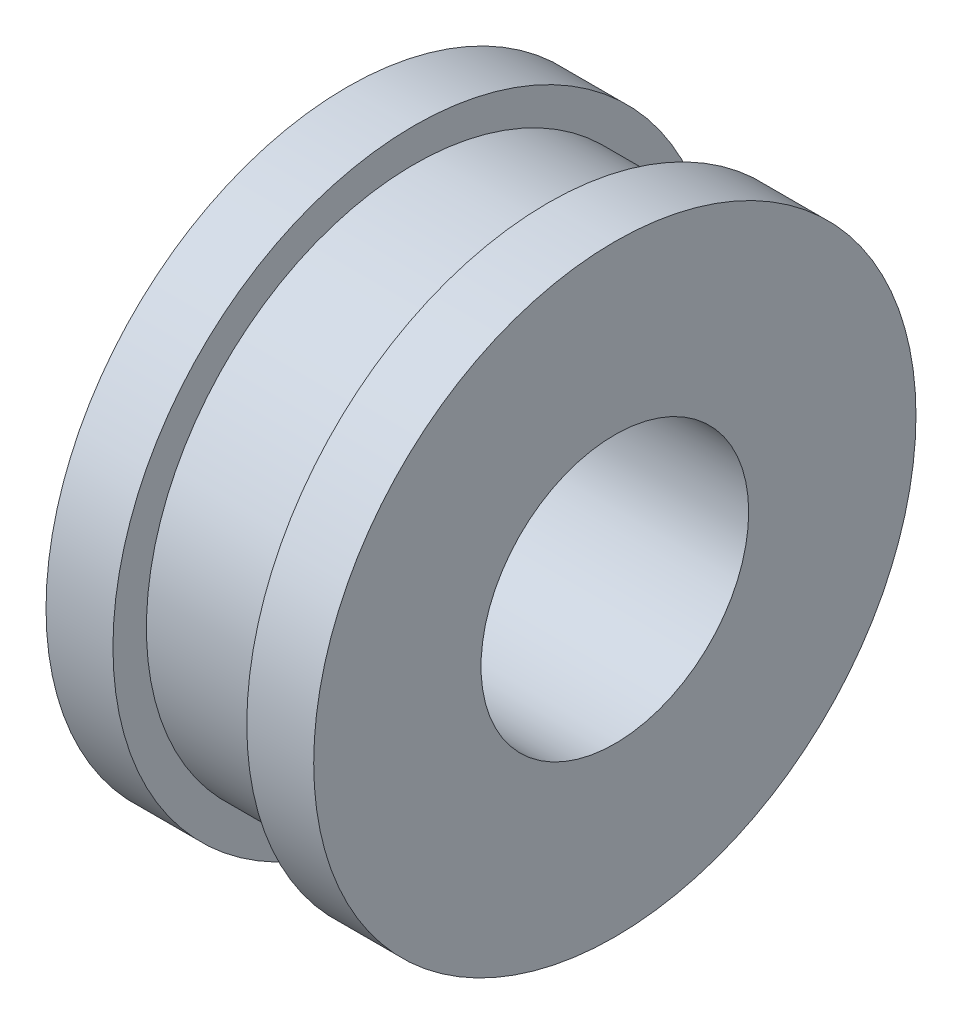
ISO-10303-21;
HEADER;
FILE_DESCRIPTION(('STEP AP214'),'2;1');
FILE_NAME('part.step','',(''),(''),'','','');
FILE_SCHEMA(('AUTOMOTIVE_DESIGN { 1 0 10303 214 1 1 1 1 }'));
ENDSEC;
DATA;
#1=APPLICATION_CONTEXT('core data for automotive mechanical design processes');
#2=APPLICATION_PROTOCOL_DEFINITION('international standard','automotive_design',2000,#1);
#3=PRODUCT_CONTEXT('',#1,'mechanical');
#4=PRODUCT('Part','Part','',(#3));
#5=PRODUCT_RELATED_PRODUCT_CATEGORY('part','',(#4));
#6=PRODUCT_DEFINITION_FORMATION('','',#4);
#7=PRODUCT_DEFINITION_CONTEXT('part definition',#1,'design');
#8=PRODUCT_DEFINITION('design','',#6,#7);
#9=PRODUCT_DEFINITION_SHAPE('','',#8);
#10=(LENGTH_UNIT() NAMED_UNIT(*) SI_UNIT(.MILLI.,.METRE.));
#11=(NAMED_UNIT(*) PLANE_ANGLE_UNIT() SI_UNIT($,.RADIAN.));
#12=(NAMED_UNIT(*) SI_UNIT($,.STERADIAN.) SOLID_ANGLE_UNIT());
#13=UNCERTAINTY_MEASURE_WITH_UNIT(LENGTH_MEASURE(1.E-05),#10,'distance_accuracy_value','');
#14=(GEOMETRIC_REPRESENTATION_CONTEXT(3) GLOBAL_UNCERTAINTY_ASSIGNED_CONTEXT((#13)) GLOBAL_UNIT_ASSIGNED_CONTEXT((#10,
#11,#12)) REPRESENTATION_CONTEXT('',''));
#15=CARTESIAN_POINT('',(0.,0.,0.));
#16=DIRECTION('',(0.,0.,1.));
#17=DIRECTION('',(1.,0.,0.));
#18=AXIS2_PLACEMENT_3D('',#15,#16,#17);
#19=CARTESIAN_POINT('',(-6.,4.,0.));
#20=DIRECTION('',(-1.,0.,0.));
#21=DIRECTION('',(0.,0.,1.));
#22=AXIS2_PLACEMENT_3D('',#19,#20,#21);
#23=PLANE('',#22);
#24=CARTESIAN_POINT('',(-6.,0.,0.));
#25=DIRECTION('',(1.,0.,0.));
#26=DIRECTION('',(0.,0.,-1.));
#27=AXIS2_PLACEMENT_3D('',#24,#25,#26);
#28=CIRCLE('',#27,4.);
#29=CARTESIAN_POINT('',(-6.,0.,-4.));
#30=VERTEX_POINT('',#29);
#31=EDGE_CURVE('E74',#30,#30,#28,.T.);
#32=ORIENTED_EDGE('',*,*,#31,.T.);
#33=EDGE_LOOP('',(#32));
#34=FACE_BOUND('',#33,.T.);
#35=CARTESIAN_POINT('',(-6.,0.,0.));
#36=DIRECTION('',(1.,0.,0.));
#37=DIRECTION('',(0.,0.,-1.));
#38=AXIS2_PLACEMENT_3D('',#35,#36,#37);
#39=CIRCLE('',#38,9.);
#40=CARTESIAN_POINT('',(-6.,0.,-9.));
#41=VERTEX_POINT('',#40);
#42=EDGE_CURVE('E10',#41,#41,#39,.T.);
#43=ORIENTED_EDGE('',*,*,#42,.F.);
#44=EDGE_LOOP('',(#43));
#45=FACE_BOUND('',#44,.T.);
#46=ADVANCED_FACE('F39',(#34,#45),#23,.T.);
#47=CARTESIAN_POINT('',(0.,0.,0.));
#48=DIRECTION('',(1.,0.,0.));
#49=DIRECTION('',(0.,0.,-1.));
#50=AXIS2_PLACEMENT_3D('',#47,#48,#49);
#51=CYLINDRICAL_SURFACE('',#50,9.);
#52=ORIENTED_EDGE('',*,*,#42,.T.);
#53=EDGE_LOOP('',(#52));
#54=FACE_BOUND('',#53,.T.);
#55=CARTESIAN_POINT('',(-4.,0.,0.));
#56=DIRECTION('',(1.,0.,0.));
#57=DIRECTION('',(0.,0.,-1.));
#58=AXIS2_PLACEMENT_3D('',#55,#56,#57);
#59=CIRCLE('',#58,9.);
#60=CARTESIAN_POINT('',(-4.,0.,-9.));
#61=VERTEX_POINT('',#60);
#62=EDGE_CURVE('E46',#61,#61,#59,.T.);
#63=ORIENTED_EDGE('',*,*,#62,.F.);
#64=EDGE_LOOP('',(#63));
#65=FACE_BOUND('',#64,.T.);
#66=ADVANCED_FACE('F93',(#54,#65),#51,.T.);
#67=CARTESIAN_POINT('',(-4.,9.,0.));
#68=DIRECTION('',(1.,0.,0.));
#69=DIRECTION('',(0.,0.,-1.));
#70=AXIS2_PLACEMENT_3D('',#67,#68,#69);
#71=PLANE('',#70);
#72=ORIENTED_EDGE('',*,*,#62,.T.);
#73=EDGE_LOOP('',(#72));
#74=FACE_BOUND('',#73,.T.);
#75=CARTESIAN_POINT('',(-4.,0.,0.));
#76=DIRECTION('',(1.,0.,0.));
#77=DIRECTION('',(0.,0.,-1.));
#78=AXIS2_PLACEMENT_3D('',#75,#76,#77);
#79=CIRCLE('',#78,8.);
#80=CARTESIAN_POINT('',(-4.,0.,-8.));
#81=VERTEX_POINT('',#80);
#82=EDGE_CURVE('E51',#81,#81,#79,.T.);
#83=ORIENTED_EDGE('',*,*,#82,.F.);
#84=EDGE_LOOP('',(#83));
#85=FACE_BOUND('',#84,.T.);
#86=ADVANCED_FACE('F97',(#74,#85),#71,.T.);
#87=CARTESIAN_POINT('',(0.,0.,0.));
#88=DIRECTION('',(1.,0.,0.));
#89=DIRECTION('',(0.,0.,-1.));
#90=AXIS2_PLACEMENT_3D('',#87,#88,#89);
#91=CYLINDRICAL_SURFACE('',#90,8.);
#92=ORIENTED_EDGE('',*,*,#82,.T.);
#93=EDGE_LOOP('',(#92));
#94=FACE_BOUND('',#93,.T.);
#95=CARTESIAN_POINT('',(0.,0.,0.));
#96=DIRECTION('',(1.,0.,0.));
#97=DIRECTION('',(0.,0.,-1.));
#98=AXIS2_PLACEMENT_3D('',#95,#96,#97);
#99=CIRCLE('',#98,8.);
#100=CARTESIAN_POINT('',(0.,0.,-8.));
#101=VERTEX_POINT('',#100);
#102=EDGE_CURVE('E56',#101,#101,#99,.T.);
#103=ORIENTED_EDGE('',*,*,#102,.F.);
#104=EDGE_LOOP('',(#103));
#105=FACE_BOUND('',#104,.T.);
#106=ADVANCED_FACE('F101',(#94,#105),#91,.T.);
#107=CARTESIAN_POINT('',(0.,8.,0.));
#108=DIRECTION('',(-1.,0.,0.));
#109=DIRECTION('',(0.,0.,1.));
#110=AXIS2_PLACEMENT_3D('',#107,#108,#109);
#111=PLANE('',#110);
#112=ORIENTED_EDGE('',*,*,#102,.T.);
#113=EDGE_LOOP('',(#112));
#114=FACE_BOUND('',#113,.T.);
#115=CARTESIAN_POINT('',(0.,0.,0.));
#116=DIRECTION('',(1.,0.,0.));
#117=DIRECTION('',(0.,0.,-1.));
#118=AXIS2_PLACEMENT_3D('',#115,#116,#117);
#119=CIRCLE('',#118,9.);
#120=CARTESIAN_POINT('',(0.,0.,-9.));
#121=VERTEX_POINT('',#120);
#122=EDGE_CURVE('E62',#121,#121,#119,.T.);
#123=ORIENTED_EDGE('',*,*,#122,.F.);
#124=EDGE_LOOP('',(#123));
#125=FACE_BOUND('',#124,.T.);
#126=ADVANCED_FACE('F107',(#114,#125),#111,.T.);
#127=CARTESIAN_POINT('',(0.,0.,0.));
#128=DIRECTION('',(1.,0.,0.));
#129=DIRECTION('',(0.,0.,-1.));
#130=AXIS2_PLACEMENT_3D('',#127,#128,#129);
#131=CYLINDRICAL_SURFACE('',#130,9.);
#132=ORIENTED_EDGE('',*,*,#122,.T.);
#133=EDGE_LOOP('',(#132));
#134=FACE_BOUND('',#133,.T.);
#135=CARTESIAN_POINT('',(2.,0.,0.));
#136=DIRECTION('',(1.,0.,0.));
#137=DIRECTION('',(0.,0.,-1.));
#138=AXIS2_PLACEMENT_3D('',#135,#136,#137);
#139=CIRCLE('',#138,9.);
#140=CARTESIAN_POINT('',(2.,0.,-9.));
#141=VERTEX_POINT('',#140);
#142=EDGE_CURVE('E66',#141,#141,#139,.T.);
#143=ORIENTED_EDGE('',*,*,#142,.F.);
#144=EDGE_LOOP('',(#143));
#145=FACE_BOUND('',#144,.T.);
#146=ADVANCED_FACE('F89',(#134,#145),#131,.T.);
#147=CARTESIAN_POINT('',(2.,9.,0.));
#148=DIRECTION('',(1.,0.,0.));
#149=DIRECTION('',(0.,0.,-1.));
#150=AXIS2_PLACEMENT_3D('',#147,#148,#149);
#151=PLANE('',#150);
#152=ORIENTED_EDGE('',*,*,#142,.T.);
#153=EDGE_LOOP('',(#152));
#154=FACE_BOUND('',#153,.T.);
#155=CARTESIAN_POINT('',(2.,0.,0.));
#156=DIRECTION('',(1.,0.,0.));
#157=DIRECTION('',(0.,0.,-1.));
#158=AXIS2_PLACEMENT_3D('',#155,#156,#157);
#159=CIRCLE('',#158,4.);
#160=CARTESIAN_POINT('',(2.,0.,-4.));
#161=VERTEX_POINT('',#160);
#162=EDGE_CURVE('E70',#161,#161,#159,.T.);
#163=ORIENTED_EDGE('',*,*,#162,.F.);
#164=EDGE_LOOP('',(#163));
#165=FACE_BOUND('',#164,.T.);
#166=ADVANCED_FACE('F83',(#154,#165),#151,.T.);
#167=CARTESIAN_POINT('',(0.,0.,0.));
#168=DIRECTION('',(1.,0.,0.));
#169=DIRECTION('',(0.,0.,-1.));
#170=AXIS2_PLACEMENT_3D('',#167,#168,#169);
#171=CYLINDRICAL_SURFACE('',#170,4.);
#172=ORIENTED_EDGE('',*,*,#162,.T.);
#173=EDGE_LOOP('',(#172));
#174=FACE_BOUND('',#173,.T.);
#175=ORIENTED_EDGE('',*,*,#31,.F.);
#176=EDGE_LOOP('',(#175));
#177=FACE_BOUND('',#176,.T.);
#178=ADVANCED_FACE('F81',(#174,#177),#171,.F.);
#179=CLOSED_SHELL('',(#46,#66,#86,#106,#126,#146,#166,#178));
#180=MANIFOLD_SOLID_BREP('B2',#179);
#181=ADVANCED_BREP_SHAPE_REPRESENTATION('',(#18,#180),#14);
#182=SHAPE_DEFINITION_REPRESENTATION(#9,#181);
ENDSEC;
END-ISO-10303-21;
